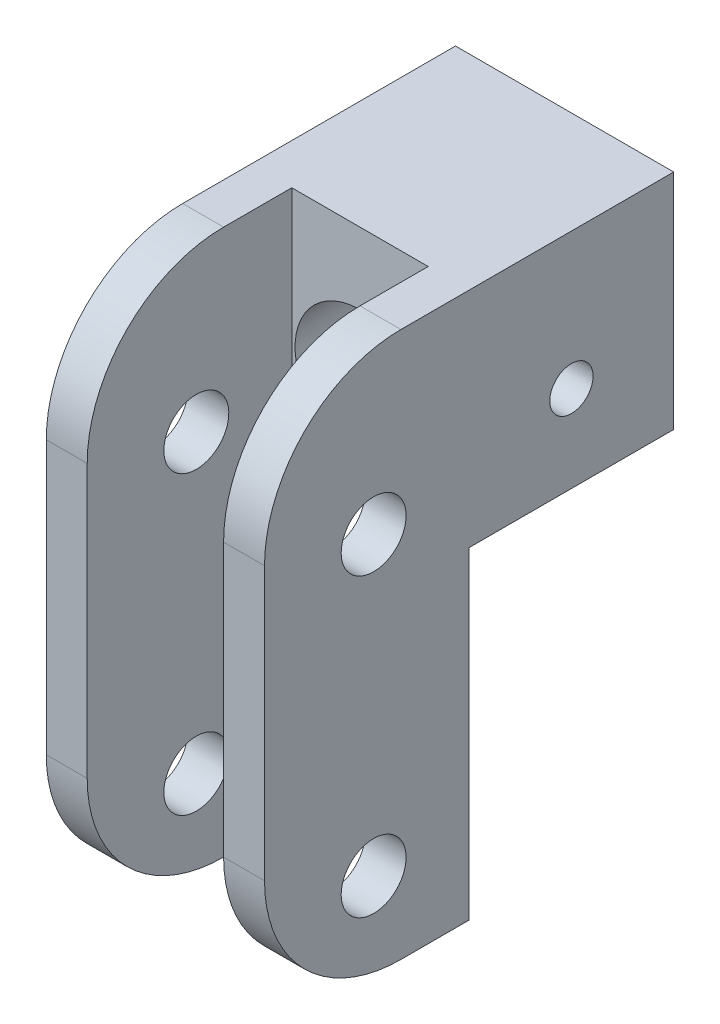
ISO-10303-21;
HEADER;
FILE_DESCRIPTION(('STEP AP214'),'2;1');
FILE_NAME('part.step','',(''),(''),'','','');
FILE_SCHEMA(('AUTOMOTIVE_DESIGN { 1 0 10303 214 1 1 1 1 }'));
ENDSEC;
DATA;
#1=APPLICATION_CONTEXT('core data for automotive mechanical design processes');
#2=APPLICATION_PROTOCOL_DEFINITION('international standard','automotive_design',2000,#1);
#3=PRODUCT_CONTEXT('',#1,'mechanical');
#4=PRODUCT('Part','Part','',(#3));
#5=PRODUCT_RELATED_PRODUCT_CATEGORY('part','',(#4));
#6=PRODUCT_DEFINITION_FORMATION('','',#4);
#7=PRODUCT_DEFINITION_CONTEXT('part definition',#1,'design');
#8=PRODUCT_DEFINITION('design','',#6,#7);
#9=PRODUCT_DEFINITION_SHAPE('','',#8);
#10=(LENGTH_UNIT() NAMED_UNIT(*) SI_UNIT(.MILLI.,.METRE.));
#11=(NAMED_UNIT(*) PLANE_ANGLE_UNIT() SI_UNIT($,.RADIAN.));
#12=(NAMED_UNIT(*) SI_UNIT($,.STERADIAN.) SOLID_ANGLE_UNIT());
#13=UNCERTAINTY_MEASURE_WITH_UNIT(LENGTH_MEASURE(1.E-05),#10,'distance_accuracy_value','');
#14=(GEOMETRIC_REPRESENTATION_CONTEXT(3) GLOBAL_UNCERTAINTY_ASSIGNED_CONTEXT((#13)) GLOBAL_UNIT_ASSIGNED_CONTEXT((#10,
#11,#12)) REPRESENTATION_CONTEXT('',''));
#15=CARTESIAN_POINT('',(0.,0.,0.));
#16=DIRECTION('',(0.,0.,1.));
#17=DIRECTION('',(1.,0.,0.));
#18=AXIS2_PLACEMENT_3D('',#15,#16,#17);
#19=CARTESIAN_POINT('',(-7.99999999999999,-30.,30.));
#20=DIRECTION('',(0.,1.,0.));
#21=DIRECTION('',(-1.,0.,0.));
#22=AXIS2_PLACEMENT_3D('',#19,#20,#21);
#23=PLANE('',#22);
#24=DIRECTION('',(0.,0.,1.));
#25=VECTOR('',#24,1.);
#26=CARTESIAN_POINT('',(-5.,-30.,-41.2310562561766));
#27=LINE('',#26,#25);
#28=CARTESIAN_POINT('',(-5.,-30.,15.));
#29=VERTEX_POINT('',#28);
#30=CARTESIAN_POINT('',(-5.,-30.,20.));
#31=VERTEX_POINT('',#30);
#32=EDGE_CURVE('E218',#29,#31,#27,.T.);
#33=ORIENTED_EDGE('',*,*,#32,.T.);
#34=DIRECTION('',(1.,0.,0.));
#35=VECTOR('',#34,1.);
#36=CARTESIAN_POINT('',(-7.99999999999999,-30.,20.));
#37=LINE('',#36,#35);
#38=CARTESIAN_POINT('',(-7.99999999999999,-30.,20.));
#39=VERTEX_POINT('',#38);
#40=EDGE_CURVE('E150',#31,#39,#37,.F.);
#41=ORIENTED_EDGE('',*,*,#40,.T.);
#42=DIRECTION('',(0.,0.,-1.));
#43=VECTOR('',#42,1.);
#44=CARTESIAN_POINT('',(-7.99999999999999,-30.,30.));
#45=LINE('',#44,#43);
#46=CARTESIAN_POINT('',(-7.99999999999999,-30.,15.));
#47=VERTEX_POINT('',#46);
#48=EDGE_CURVE('E144',#39,#47,#45,.T.);
#49=ORIENTED_EDGE('',*,*,#48,.T.);
#50=DIRECTION('',(-1.,0.,0.));
#51=VECTOR('',#50,1.);
#52=CARTESIAN_POINT('',(8.00000000000002,-30.,15.));
#53=LINE('',#52,#51);
#54=EDGE_CURVE('E147',#29,#47,#53,.T.);
#55=ORIENTED_EDGE('',*,*,#54,.F.);
#56=EDGE_LOOP('',(#33,#41,#49,#55));
#57=FACE_BOUND('',#56,.T.);
#58=ADVANCED_FACE('F35',(#57),#23,.F.);
#59=CARTESIAN_POINT('',(0.,0.,30.));
#60=DIRECTION('',(0.,0.,1.));
#61=DIRECTION('',(1.,0.,0.));
#62=AXIS2_PLACEMENT_3D('',#59,#60,#61);
#63=PLANE('',#62);
#64=DIRECTION('',(0.,1.,0.));
#65=VECTOR('',#64,1.);
#66=CARTESIAN_POINT('',(5.,10.,30.));
#67=LINE('',#66,#65);
#68=CARTESIAN_POINT('',(5.,-20.,30.));
#69=VERTEX_POINT('',#68);
#70=CARTESIAN_POINT('',(5.,0.,30.));
#71=VERTEX_POINT('',#70);
#72=EDGE_CURVE('E204',#69,#71,#67,.T.);
#73=ORIENTED_EDGE('',*,*,#72,.F.);
#74=DIRECTION('',(1.,0.,0.));
#75=VECTOR('',#74,1.);
#76=CARTESIAN_POINT('',(8.00000000000001,-20.,30.));
#77=LINE('',#76,#75);
#78=CARTESIAN_POINT('',(8.00000000000001,-20.,30.));
#79=VERTEX_POINT('',#78);
#80=EDGE_CURVE('E362',#69,#79,#77,.T.);
#81=ORIENTED_EDGE('',*,*,#80,.T.);
#82=DIRECTION('',(0.,1.,0.));
#83=VECTOR('',#82,1.);
#84=CARTESIAN_POINT('',(8.00000000000002,-30.,30.));
#85=LINE('',#84,#83);
#86=CARTESIAN_POINT('',(8.00000000000001,0.,30.));
#87=VERTEX_POINT('',#86);
#88=EDGE_CURVE('E239',#79,#87,#85,.T.);
#89=ORIENTED_EDGE('',*,*,#88,.T.);
#90=DIRECTION('',(-1.,0.,0.));
#91=VECTOR('',#90,1.);
#92=CARTESIAN_POINT('',(5.00000000000001,0.,30.));
#93=LINE('',#92,#91);
#94=EDGE_CURVE('E361',#87,#71,#93,.T.);
#95=ORIENTED_EDGE('',*,*,#94,.T.);
#96=EDGE_LOOP('',(#73,#81,#89,#95));
#97=FACE_BOUND('',#96,.T.);
#98=ADVANCED_FACE('F316',(#97),#63,.T.);
#99=CARTESIAN_POINT('',(0.,0.,30.));
#100=DIRECTION('',(0.,0.,1.));
#101=DIRECTION('',(1.,0.,0.));
#102=AXIS2_PLACEMENT_3D('',#99,#100,#101);
#103=CYLINDRICAL_SURFACE('',#102,4.76249999999999);
#104=CARTESIAN_POINT('',(0.,0.,0.));
#105=DIRECTION('',(0.,0.,1.));
#106=DIRECTION('',(1.,0.,0.));
#107=AXIS2_PLACEMENT_3D('',#104,#105,#106);
#108=CIRCLE('',#107,4.76249999999999);
#109=CARTESIAN_POINT('',(4.76249999999999,0.,0.));
#110=VERTEX_POINT('',#109);
#111=EDGE_CURVE('E234',#110,#110,#108,.T.);
#112=ORIENTED_EDGE('',*,*,#111,.F.);
#113=EDGE_LOOP('',(#112));
#114=FACE_BOUND('',#113,.T.);
#115=CARTESIAN_POINT('',(-4.76249999999999,0.,9.0875));
#116=CARTESIAN_POINT('',(-4.76250024290248,0.0866193385826708,9.08750040279898));
#117=CARTESIAN_POINT('',(-4.76011509093226,0.173236246329945,9.08038757752304));
#118=CARTESIAN_POINT('',(-4.75083521197707,0.343918795385841,9.05221128975266));
#119=CARTESIAN_POINT('',(-4.74394001683416,0.42798417088862,9.03114637898108));
#120=CARTESIAN_POINT('',(-4.72638926301477,0.591078303334067,8.97586820112782));
#121=CARTESIAN_POINT('',(-4.71573999272729,0.670115223594076,8.9416769133459));
#122=CARTESIAN_POINT('',(-4.69176807576279,0.82133271217845,8.86121588811912));
#123=CARTESIAN_POINT('',(-4.67844490185097,0.893511924171942,8.81494376805837));
#124=CARTESIAN_POINT('',(-4.6500112492827,1.03146490909784,8.70995153478673));
#125=CARTESIAN_POINT('',(-4.63485795886257,1.09696837422356,8.65088791561146));
#126=CARTESIAN_POINT('',(-4.60470749718204,1.21734689966455,8.52271964190333));
#127=CARTESIAN_POINT('',(-4.58971036098746,1.27221961946452,8.45361278205099));
#128=CARTESIAN_POINT('',(-4.56109915307671,1.37132209578672,8.30488612962562));
#129=CARTESIAN_POINT('',(-4.54753724850154,1.41520046242588,8.22502118817525));
#130=CARTESIAN_POINT('',(-4.52398297352028,1.48878746228088,8.05852045004706));
#131=CARTESIAN_POINT('',(-4.51398951405183,1.51850041960148,7.97188672900414));
#132=CARTESIAN_POINT('',(-4.49915443940135,1.56189912014579,7.79738126087397));
#133=CARTESIAN_POINT('',(-4.49415052034257,1.57609134913143,7.70964968152361));
#134=CARTESIAN_POINT('',(-4.48938104899342,1.58962903329348,7.53291879027754));
#135=CARTESIAN_POINT('',(-4.48961387798583,1.58897907629748,7.44391987862416));
#136=CARTESIAN_POINT('',(-4.49514936325485,1.57324409712917,7.27150059917012));
#137=CARTESIAN_POINT('',(-4.50021985189708,1.5588200871526,7.18801116036606));
#138=CARTESIAN_POINT('',(-4.51447944137724,1.51702478352344,7.02471294637415));
#139=CARTESIAN_POINT('',(-4.5236690353227,1.48965193971459,6.94490461312183));
#140=CARTESIAN_POINT('',(-4.54529683920856,1.42230325467058,6.78973226002353));
#141=CARTESIAN_POINT('',(-4.55778498196573,1.38213155232277,6.71446050956713));
#142=CARTESIAN_POINT('',(-4.58458186738965,1.29046145625623,6.57151743310594));
#143=CARTESIAN_POINT('',(-4.5988911354236,1.23895979087785,6.50384831099326));
#144=CARTESIAN_POINT('',(-4.62863135053787,1.12291706563305,6.37431708791978));
#145=CARTESIAN_POINT('',(-4.64408185600812,1.05783562574614,6.31294259746686));
#146=CARTESIAN_POINT('',(-4.6737101468942,0.918114067327472,6.20185161417186));
#147=CARTESIAN_POINT('',(-4.68788781016681,0.843473033111539,6.15213623941387));
#148=CARTESIAN_POINT('',(-4.71355908851246,0.685716835710946,6.06538212337683));
#149=CARTESIAN_POINT('',(-4.72502468137761,0.602524951310931,6.02847403249659));
#150=CARTESIAN_POINT('',(-4.74377650341789,0.430639669841153,5.96932746134531));
#151=CARTESIAN_POINT('',(-4.7510641842712,0.341948195570986,5.9470838852653));
#152=CARTESIAN_POINT('',(-4.76039857975911,0.165709329377767,5.91876163018951));
#153=CARTESIAN_POINT('',(-4.76265877911042,0.0782789897854404,5.91202405293826));
#154=CARTESIAN_POINT('',(-4.76232383028037,-0.0964804235618793,5.91302811933757));
#155=CARTESIAN_POINT('',(-4.75972950165737,-0.183809511919947,5.92076731896806));
#156=CARTESIAN_POINT('',(-4.75011789238402,-0.353250287758008,5.94998390353084));
#157=CARTESIAN_POINT('',(-4.74323090454017,-0.435439830850316,5.97105685210358));
#158=CARTESIAN_POINT('',(-4.72585806842735,-0.595083834245074,6.02583709309094));
#159=CARTESIAN_POINT('',(-4.71537176124095,-0.672537689257414,6.05954599665511));
#160=CARTESIAN_POINT('',(-4.69152178418571,-0.822782670524322,6.13962431054725));
#161=CARTESIAN_POINT('',(-4.67808968424809,-0.895397560257221,6.18630341683704));
#162=CARTESIAN_POINT('',(-4.64987090592065,-1.03197791784024,6.29063321314641));
#163=CARTESIAN_POINT('',(-4.635083814552,-1.09594073387548,6.34828725395043));
#164=CARTESIAN_POINT('',(-4.60496996168955,-1.2164258561425,6.47602876722296));
#165=CARTESIAN_POINT('',(-4.58964920726291,-1.27247803867766,6.54656214774639));
#166=CARTESIAN_POINT('',(-4.56088707605349,-1.37200881668867,6.69636236389979));
#167=CARTESIAN_POINT('',(-4.54744571493928,-1.41548730734048,6.7756292723316));
#168=CARTESIAN_POINT('',(-4.5240954696882,-1.48843512703597,6.94068091177271));
#169=CARTESIAN_POINT('',(-4.51417945258853,-1.51793278481197,7.02645205068042));
#170=CARTESIAN_POINT('',(-4.49914696286487,-1.56193278348048,7.20215110694506));
#171=CARTESIAN_POINT('',(-4.49402832815026,-1.57644187973938,7.29207713257941));
#172=CARTESIAN_POINT('',(-4.48941600962755,-1.58952609843278,7.46856288996496));
#173=CARTESIAN_POINT('',(-4.48964685408645,-1.58888153347708,7.55505821520533));
#174=CARTESIAN_POINT('',(-4.49502640845388,-1.5735971408498,7.72663955643877));
#175=CARTESIAN_POINT('',(-4.5001748256636,-1.5589581461405,7.8117256560037));
#176=CARTESIAN_POINT('',(-4.51460432334014,-1.51665275334283,7.97646536501643));
#177=CARTESIAN_POINT('',(-4.52380505610682,-1.48923906179963,8.05619145969464));
#178=CARTESIAN_POINT('',(-4.54527283124318,-1.4223672431436,8.2099735085145));
#179=CARTESIAN_POINT('',(-4.55754055411885,-1.38290644257917,8.28402819951096));
#180=CARTESIAN_POINT('',(-4.58442741396347,-1.29105134947619,8.42786782600262));
#181=CARTESIAN_POINT('',(-4.59912579731891,-1.23816783538877,8.49732544676369));
#182=CARTESIAN_POINT('',(-4.62888578099663,-1.12179557697784,8.62663257874742));
#183=CARTESIAN_POINT('',(-4.6439474829839,-1.05830383406673,8.68647936390482));
#184=CARTESIAN_POINT('',(-4.673441734593,-0.919545971611592,8.79721675450907));
#185=CARTESIAN_POINT('',(-4.68782688609494,-0.843917402680819,8.84766740205471));
#186=CARTESIAN_POINT('',(-4.71370010986521,-0.684779804883016,8.9350848058004));
#187=CARTESIAN_POINT('',(-4.72518892253837,-0.601272797535103,8.97205500915124));
#188=CARTESIAN_POINT('',(-4.74353755171309,-0.43258366493155,9.02990809157576));
#189=CARTESIAN_POINT('',(-4.75058124720754,-0.3476430653113,9.05143591519311));
#190=CARTESIAN_POINT('',(-4.76006171214451,-0.175133660416269,9.08022969557494));
#191=CARTESIAN_POINT('',(-4.76249975444398,-0.087565588090387,9.08749959280075));
#192=CARTESIAN_POINT('',(-4.76249999999999,0.,9.0875));
#193=B_SPLINE_CURVE_WITH_KNOTS('',3,(#115,#116,#117,#118,#119,#120,#121,#122,#123,#124,#125,
#126,#127,#128,#129,#130,#131,#132,#133,#134,#135,#136,#137,#138,#139,#140,#141,#142,#143,#144,
#145,#146,#147,#148,#149,#150,#151,#152,#153,#154,#155,#156,#157,#158,#159,#160,#161,#162,#163,
#164,#165,#166,#167,#168,#169,#170,#171,#172,#173,#174,#175,#176,#177,#178,#179,#180,#181,#182,
#183,#184,#185,#186,#187,#188,#189,#190,#191,#192),.UNSPECIFIED.,.T.,.F.,(4,2,2,2,2,2,2,2,2,2,2,
2,2,2,2,2,2,2,2,2,2,2,2,2,2,2,2,2,2,2,2,2,2,2,2,2,2,2,4),(0.,0.259535780816292,
0.519098506612188,0.778228493181558,1.03740962475607,1.30468186298875,1.57201287843954,
1.84703060907259,2.12196433449873,2.38763057115171,2.65321468955133,2.90666212150157,
3.16013990233077,3.41769971708769,3.67533400311153,3.94641872975544,4.21752944222006,
4.49132968969942,4.76503474342567,5.02687563290581,5.28867232148129,5.54288575790413,
5.79713161888514,6.0580650975193,6.31907837054751,6.59195123823192,6.86482638073056,
7.13714621949997,7.4093432697052,7.66755619877009,7.92575375970307,8.17904744490161,
8.43239738104363,8.69680230873239,8.96128210158997,9.2360696157572,9.51078681329523,
9.77323036418427,10.0356013733555),.UNSPECIFIED.);
#194=CARTESIAN_POINT('',(-4.76249999999999,0.,9.0875));
#195=VERTEX_POINT('',#194);
#196=EDGE_CURVE('E233',#195,#195,#193,.T.);
#197=ORIENTED_EDGE('',*,*,#196,.T.);
#198=EDGE_LOOP('',(#197));
#199=FACE_BOUND('',#198,.T.);
#200=CARTESIAN_POINT('',(4.76249999999999,0.,5.9125));
#201=CARTESIAN_POINT('',(4.76250024290248,0.0866193385826729,5.91249959720102));
#202=CARTESIAN_POINT('',(4.76011509093226,0.173236246329947,5.91961242247696));
#203=CARTESIAN_POINT('',(4.75083521197707,0.343918795385843,5.94778871024734));
#204=CARTESIAN_POINT('',(4.74394001683416,0.427984170888622,5.96885362101892));
#205=CARTESIAN_POINT('',(4.72638926301477,0.591078303334068,6.02413179887218));
#206=CARTESIAN_POINT('',(4.71573999272729,0.670115223594078,6.0583230866541));
#207=CARTESIAN_POINT('',(4.69176807576279,0.821332712178451,6.13878411188088));
#208=CARTESIAN_POINT('',(4.67844490185096,0.893511924171943,6.18505623194163));
#209=CARTESIAN_POINT('',(4.65001124928269,1.03146490909785,6.29004846521327));
#210=CARTESIAN_POINT('',(4.63485795886257,1.09696837422356,6.34911208438854));
#211=CARTESIAN_POINT('',(4.60470749718204,1.21734689966456,6.47728035809668));
#212=CARTESIAN_POINT('',(4.58971036098746,1.27221961946452,6.54638721794902));
#213=CARTESIAN_POINT('',(4.56109915307671,1.37132209578672,6.69511387037438));
#214=CARTESIAN_POINT('',(4.54753724850154,1.41520046242588,6.77497881182475));
#215=CARTESIAN_POINT('',(4.52398297352028,1.48878746228088,6.94147954995295));
#216=CARTESIAN_POINT('',(4.51398951405183,1.51850041960148,7.02811327099586));
#217=CARTESIAN_POINT('',(4.49915443940135,1.56189912014579,7.20261873912603));
#218=CARTESIAN_POINT('',(4.49415052034257,1.57609134913143,7.29035031847639));
#219=CARTESIAN_POINT('',(4.48938104899342,1.58962903329348,7.46708120972246));
#220=CARTESIAN_POINT('',(4.48961387798583,1.58897907629748,7.55608012137584));
#221=CARTESIAN_POINT('',(4.49514936325485,1.57324409712917,7.72849940082989));
#222=CARTESIAN_POINT('',(4.50021985189708,1.5588200871526,7.81198883963394));
#223=CARTESIAN_POINT('',(4.51447944137724,1.51702478352344,7.97528705362585));
#224=CARTESIAN_POINT('',(4.5236690353227,1.48965193971459,8.05509538687817));
#225=CARTESIAN_POINT('',(4.54529683920856,1.42230325467058,8.21026773997647));
#226=CARTESIAN_POINT('',(4.55778498196573,1.38213155232277,8.28553949043287));
#227=CARTESIAN_POINT('',(4.58458186738965,1.29046145625623,8.42848256689406));
#228=CARTESIAN_POINT('',(4.5988911354236,1.23895979087785,8.49615168900674));
#229=CARTESIAN_POINT('',(4.62863135053787,1.12291706563305,8.62568291208023));
#230=CARTESIAN_POINT('',(4.64408185600812,1.05783562574614,8.68705740253315));
#231=CARTESIAN_POINT('',(4.6737101468942,0.918114067327471,8.79814838582814));
#232=CARTESIAN_POINT('',(4.68788781016681,0.843473033111538,8.84786376058613));
#233=CARTESIAN_POINT('',(4.71355908851246,0.685716835710945,8.93461787662317));
#234=CARTESIAN_POINT('',(4.72502468137761,0.60252495131093,8.97152596750341));
#235=CARTESIAN_POINT('',(4.74377650341789,0.430639669841151,9.03067253865469));
#236=CARTESIAN_POINT('',(4.7510641842712,0.341948195570984,9.0529161147347));
#237=CARTESIAN_POINT('',(4.76039857975911,0.165709329377765,9.08123836981049));
#238=CARTESIAN_POINT('',(4.76265877911042,0.0782789897854381,9.08797594706174));
#239=CARTESIAN_POINT('',(4.76232383028037,-0.0964804235618813,9.08697188066243));
#240=CARTESIAN_POINT('',(4.75972950165736,-0.183809511919949,9.07923268103194));
#241=CARTESIAN_POINT('',(4.75011789238402,-0.353250287758009,9.05001609646916));
#242=CARTESIAN_POINT('',(4.74323090454017,-0.435439830850318,9.02894314789643));
#243=CARTESIAN_POINT('',(4.72585806842735,-0.595083834245076,8.97416290690907));
#244=CARTESIAN_POINT('',(4.71537176124095,-0.672537689257415,8.94045400334489));
#245=CARTESIAN_POINT('',(4.69152178418571,-0.822782670524323,8.86037568945275));
#246=CARTESIAN_POINT('',(4.67808968424809,-0.895397560257222,8.81369658316296));
#247=CARTESIAN_POINT('',(4.64987090592065,-1.03197791784025,8.70936678685359));
#248=CARTESIAN_POINT('',(4.635083814552,-1.09594073387548,8.65171274604957));
#249=CARTESIAN_POINT('',(4.60496996168955,-1.2164258561425,8.52397123277704));
#250=CARTESIAN_POINT('',(4.58964920726291,-1.27247803867766,8.4534378522536));
#251=CARTESIAN_POINT('',(4.56088707605349,-1.37200881668868,8.30363763610021));
#252=CARTESIAN_POINT('',(4.54744571493927,-1.41548730734048,8.2243707276684));
#253=CARTESIAN_POINT('',(4.5240954696882,-1.48843512703597,8.05931908822729));
#254=CARTESIAN_POINT('',(4.51417945258853,-1.51793278481197,7.97354794931958));
#255=CARTESIAN_POINT('',(4.49914696286487,-1.56193278348048,7.79784889305494));
#256=CARTESIAN_POINT('',(4.49402832815026,-1.57644187973938,7.70792286742059));
#257=CARTESIAN_POINT('',(4.48941600962755,-1.58952609843278,7.53143711003504));
#258=CARTESIAN_POINT('',(4.48964685408645,-1.58888153347708,7.44494178479467));
#259=CARTESIAN_POINT('',(4.49502640845388,-1.5735971408498,7.27336044356123));
#260=CARTESIAN_POINT('',(4.5001748256636,-1.5589581461405,7.1882743439963));
#261=CARTESIAN_POINT('',(4.51460432334014,-1.51665275334283,7.02353463498357));
#262=CARTESIAN_POINT('',(4.52380505610682,-1.48923906179963,6.94380854030536));
#263=CARTESIAN_POINT('',(4.54527283124318,-1.4223672431436,6.7900264914855));
#264=CARTESIAN_POINT('',(4.55754055411886,-1.38290644257916,6.71597180048904));
#265=CARTESIAN_POINT('',(4.58442741396347,-1.29105134947619,6.57213217399738));
#266=CARTESIAN_POINT('',(4.59912579731891,-1.23816783538877,6.50267455323631));
#267=CARTESIAN_POINT('',(4.62888578099663,-1.12179557697784,6.37336742125258));
#268=CARTESIAN_POINT('',(4.6439474829839,-1.05830383406673,6.31352063609518));
#269=CARTESIAN_POINT('',(4.673441734593,-0.919545971611591,6.20278324549093));
#270=CARTESIAN_POINT('',(4.68782688609494,-0.843917402680818,6.15233259794529));
#271=CARTESIAN_POINT('',(4.71370010986521,-0.684779804883016,6.0649151941996));
#272=CARTESIAN_POINT('',(4.72518892253837,-0.601272797535102,6.02794499084876));
#273=CARTESIAN_POINT('',(4.74353755171309,-0.432583664931548,5.97009190842424));
#274=CARTESIAN_POINT('',(4.75058124720754,-0.347643065311298,5.94856408480689));
#275=CARTESIAN_POINT('',(4.76006171214451,-0.175133660416267,5.91977030442507));
#276=CARTESIAN_POINT('',(4.76249975444398,-0.0875655880903847,5.91250040719925));
#277=CARTESIAN_POINT('',(4.76249999999999,0.,5.9125));
#278=B_SPLINE_CURVE_WITH_KNOTS('',3,(#200,#201,#202,#203,#204,#205,#206,#207,#208,#209,#210,
#211,#212,#213,#214,#215,#216,#217,#218,#219,#220,#221,#222,#223,#224,#225,#226,#227,#228,#229,
#230,#231,#232,#233,#234,#235,#236,#237,#238,#239,#240,#241,#242,#243,#244,#245,#246,#247,#248,
#249,#250,#251,#252,#253,#254,#255,#256,#257,#258,#259,#260,#261,#262,#263,#264,#265,#266,#267,
#268,#269,#270,#271,#272,#273,#274,#275,#276,#277),.UNSPECIFIED.,.T.,.F.,(4,2,2,2,2,2,2,2,2,2,2,
2,2,2,2,2,2,2,2,2,2,2,2,2,2,2,2,2,2,2,2,2,2,2,2,2,2,2,4),(0.,0.259535780816292,
0.519098506612188,0.778228493181558,1.03740962475607,1.30468186298875,1.57201287843954,
1.84703060907259,2.12196433449873,2.38763057115171,2.65321468955133,2.90666212150157,
3.16013990233077,3.41769971708769,3.67533400311153,3.94641872975544,4.21752944222006,
4.49132968969942,4.76503474342567,5.02687563290581,5.28867232148129,5.54288575790413,
5.79713161888514,6.05806509751931,6.31907837054751,6.59195123823192,6.86482638073056,
7.13714621949997,7.4093432697052,7.66755619877008,7.92575375970307,8.17904744490161,
8.43239738104363,8.69680230873238,8.96128210158997,9.2360696157572,9.51078681329523,
9.77323036418427,10.0356013733554),.UNSPECIFIED.);
#279=CARTESIAN_POINT('',(4.76249999999999,0.,5.9125));
#280=VERTEX_POINT('',#279);
#281=EDGE_CURVE('E238',#280,#280,#278,.T.);
#282=ORIENTED_EDGE('',*,*,#281,.T.);
#283=EDGE_LOOP('',(#282));
#284=FACE_BOUND('',#283,.T.);
#285=CARTESIAN_POINT('',(0.,0.,15.));
#286=DIRECTION('',(0.,0.,1.));
#287=DIRECTION('',(1.,0.,0.));
#288=AXIS2_PLACEMENT_3D('',#285,#286,#287);
#289=CIRCLE('',#288,4.76249999999999);
#290=CARTESIAN_POINT('',(4.76249999999999,0.,15.));
#291=VERTEX_POINT('',#290);
#292=EDGE_CURVE('E226',#291,#291,#289,.F.);
#293=ORIENTED_EDGE('',*,*,#292,.F.);
#294=EDGE_LOOP('',(#293));
#295=FACE_BOUND('',#294,.T.);
#296=ADVANCED_FACE('F268',(#114,#199,#284,#295),#103,.F.);
#297=DIRECTION('',(0.,0.,-1.));
#298=VECTOR('',#297,1.);
#299=CARTESIAN_POINT('',(8.00000000000002,-30.,30.));
#300=LINE('',#299,#298);
#301=CARTESIAN_POINT('',(8.00000000000002,-30.,20.));
#302=VERTEX_POINT('',#301);
#303=CARTESIAN_POINT('',(8.00000000000002,-30.,15.));
#304=VERTEX_POINT('',#303);
#305=EDGE_CURVE('E254',#302,#304,#300,.T.);
#306=ORIENTED_EDGE('',*,*,#305,.F.);
#307=DIRECTION('',(1.,0.,0.));
#308=VECTOR('',#307,1.);
#309=CARTESIAN_POINT('',(5.,-30.,20.));
#310=LINE('',#309,#308);
#311=CARTESIAN_POINT('',(5.,-30.,20.));
#312=VERTEX_POINT('',#311);
#313=EDGE_CURVE('E58',#302,#312,#310,.F.);
#314=ORIENTED_EDGE('',*,*,#313,.T.);
#315=DIRECTION('',(0.,0.,1.));
#316=VECTOR('',#315,1.);
#317=CARTESIAN_POINT('',(5.,-30.,-41.2310562561766));
#318=LINE('',#317,#316);
#319=CARTESIAN_POINT('',(5.,-30.,15.));
#320=VERTEX_POINT('',#319);
#321=EDGE_CURVE('E216',#320,#312,#318,.T.);
#322=ORIENTED_EDGE('',*,*,#321,.F.);
#323=EDGE_CURVE('E164',#304,#320,#53,.T.);
#324=ORIENTED_EDGE('',*,*,#323,.F.);
#325=EDGE_LOOP('',(#306,#314,#322,#324));
#326=FACE_BOUND('',#325,.T.);
#327=ADVANCED_FACE('F318',(#326),#23,.F.);
#328=CARTESIAN_POINT('',(8.00000000000002,-30.,30.));
#329=DIRECTION('',(-1.,0.,0.));
#330=DIRECTION('',(0.,-1.,0.));
#331=AXIS2_PLACEMENT_3D('',#328,#329,#330);
#332=PLANE('',#331);
#333=CARTESIAN_POINT('',(8.00000000000002,-2.,22.));
#334=DIRECTION('',(-1.,0.,0.));
#335=DIRECTION('',(0.,0.,1.));
#336=AXIS2_PLACEMENT_3D('',#333,#334,#335);
#337=CIRCLE('',#336,2.38125);
#338=CARTESIAN_POINT('',(8.00000000000002,-2.,24.38125));
#339=VERTEX_POINT('',#338);
#340=EDGE_CURVE('E187',#339,#339,#337,.T.);
#341=ORIENTED_EDGE('',*,*,#340,.T.);
#342=EDGE_LOOP('',(#341));
#343=FACE_BOUND('',#342,.T.);
#344=CARTESIAN_POINT('',(8.00000000000003,-23.7,22.));
#345=DIRECTION('',(-1.,0.,0.));
#346=DIRECTION('',(0.,0.,1.));
#347=AXIS2_PLACEMENT_3D('',#344,#345,#346);
#348=CIRCLE('',#347,2.38124999999999);
#349=CARTESIAN_POINT('',(8.00000000000003,-23.7,24.38125));
#350=VERTEX_POINT('',#349);
#351=EDGE_CURVE('E197',#350,#350,#348,.T.);
#352=ORIENTED_EDGE('',*,*,#351,.T.);
#353=EDGE_LOOP('',(#352));
#354=FACE_BOUND('',#353,.T.);
#355=CARTESIAN_POINT('',(8.00000000000001,0.,7.5));
#356=DIRECTION('',(-1.,0.,0.));
#357=DIRECTION('',(0.,0.,1.));
#358=AXIS2_PLACEMENT_3D('',#355,#356,#357);
#359=CIRCLE('',#358,1.5875);
#360=CARTESIAN_POINT('',(8.00000000000001,0.,9.0875));
#361=VERTEX_POINT('',#360);
#362=EDGE_CURVE('E230',#361,#361,#359,.T.);
#363=ORIENTED_EDGE('',*,*,#362,.T.);
#364=EDGE_LOOP('',(#363));
#365=FACE_BOUND('',#364,.T.);
#366=ORIENTED_EDGE('',*,*,#88,.F.);
#367=CARTESIAN_POINT('',(8.00000000000001,-20.,20.));
#368=DIRECTION('',(-1.,0.,0.));
#369=DIRECTION('',(0.,-1.,0.));
#370=AXIS2_PLACEMENT_3D('',#367,#368,#369);
#371=CIRCLE('',#370,10.);
#372=EDGE_CURVE('E341',#79,#302,#371,.F.);
#373=ORIENTED_EDGE('',*,*,#372,.T.);
#374=ORIENTED_EDGE('',*,*,#305,.T.);
#375=DIRECTION('',(0.,-1.,0.));
#376=VECTOR('',#375,1.);
#377=CARTESIAN_POINT('',(8.00000000000002,-30.,15.));
#378=LINE('',#377,#376);
#379=CARTESIAN_POINT('',(8.00000000000002,-6.35,15.));
#380=VERTEX_POINT('',#379);
#381=EDGE_CURVE('E179',#380,#304,#378,.T.);
#382=ORIENTED_EDGE('',*,*,#381,.F.);
#383=DIRECTION('',(0.,0.,-1.));
#384=VECTOR('',#383,1.);
#385=CARTESIAN_POINT('',(8.00000000000002,-6.35,43.5538526297241));
#386=LINE('',#385,#384);
#387=CARTESIAN_POINT('',(8.00000000000002,-6.35,0.));
#388=VERTEX_POINT('',#387);
#389=EDGE_CURVE('E177',#380,#388,#386,.T.);
#390=ORIENTED_EDGE('',*,*,#389,.T.);
#391=DIRECTION('',(0.,1.,0.));
#392=VECTOR('',#391,1.);
#393=CARTESIAN_POINT('',(8.00000000000002,-30.,0.));
#394=LINE('',#393,#392);
#395=CARTESIAN_POINT('',(8.,10.,0.));
#396=VERTEX_POINT('',#395);
#397=EDGE_CURVE('E237',#388,#396,#394,.T.);
#398=ORIENTED_EDGE('',*,*,#397,.T.);
#399=DIRECTION('',(0.,0.,-1.));
#400=VECTOR('',#399,1.);
#401=CARTESIAN_POINT('',(8.,10.,30.));
#402=LINE('',#401,#400);
#403=CARTESIAN_POINT('',(8.,10.,20.));
#404=VERTEX_POINT('',#403);
#405=EDGE_CURVE('E252',#404,#396,#402,.T.);
#406=ORIENTED_EDGE('',*,*,#405,.F.);
#407=CARTESIAN_POINT('',(8.00000000000001,0.,20.));
#408=DIRECTION('',(-1.,0.,0.));
#409=DIRECTION('',(0.,-1.,0.));
#410=AXIS2_PLACEMENT_3D('',#407,#408,#409);
#411=CIRCLE('',#410,10.);
#412=EDGE_CURVE('E346',#404,#87,#411,.F.);
#413=ORIENTED_EDGE('',*,*,#412,.T.);
#414=EDGE_LOOP('',(#366,#373,#374,#382,#390,#398,#406,#413));
#415=FACE_BOUND('',#414,.T.);
#416=ADVANCED_FACE('F326',(#343,#354,#365,#415),#332,.F.);
#417=CARTESIAN_POINT('',(8.,10.,30.));
#418=DIRECTION('',(0.,-1.,0.));
#419=DIRECTION('',(1.,0.,0.));
#420=AXIS2_PLACEMENT_3D('',#417,#418,#419);
#421=PLANE('',#420);
#422=DIRECTION('',(0.,0.,-1.));
#423=VECTOR('',#422,1.);
#424=CARTESIAN_POINT('',(-8.,10.,30.));
#425=LINE('',#424,#423);
#426=CARTESIAN_POINT('',(-8.,10.,20.));
#427=VERTEX_POINT('',#426);
#428=CARTESIAN_POINT('',(-8.,10.,0.));
#429=VERTEX_POINT('',#428);
#430=EDGE_CURVE('E154',#427,#429,#425,.T.);
#431=ORIENTED_EDGE('',*,*,#430,.F.);
#432=DIRECTION('',(-1.,0.,0.));
#433=VECTOR('',#432,1.);
#434=CARTESIAN_POINT('',(-5.,10.,20.));
#435=LINE('',#434,#433);
#436=CARTESIAN_POINT('',(-5.,10.,20.));
#437=VERTEX_POINT('',#436);
#438=EDGE_CURVE('E12',#427,#437,#435,.F.);
#439=ORIENTED_EDGE('',*,*,#438,.T.);
#440=DIRECTION('',(0.,0.,1.));
#441=VECTOR('',#440,1.);
#442=CARTESIAN_POINT('',(-5.,10.,-41.2310562561766));
#443=LINE('',#442,#441);
#444=CARTESIAN_POINT('',(-5.,10.,15.));
#445=VERTEX_POINT('',#444);
#446=EDGE_CURVE('E220',#445,#437,#443,.T.);
#447=ORIENTED_EDGE('',*,*,#446,.F.);
#448=DIRECTION('',(1.,0.,0.));
#449=VECTOR('',#448,1.);
#450=CARTESIAN_POINT('',(5.,10.,15.));
#451=LINE('',#450,#449);
#452=CARTESIAN_POINT('',(5.,10.,15.));
#453=VERTEX_POINT('',#452);
#454=EDGE_CURVE('E210',#445,#453,#451,.T.);
#455=ORIENTED_EDGE('',*,*,#454,.T.);
#456=DIRECTION('',(0.,0.,1.));
#457=VECTOR('',#456,1.);
#458=CARTESIAN_POINT('',(5.,10.,-41.2310562561766));
#459=LINE('',#458,#457);
#460=CARTESIAN_POINT('',(5.,10.,20.));
#461=VERTEX_POINT('',#460);
#462=EDGE_CURVE('E215',#453,#461,#459,.T.);
#463=ORIENTED_EDGE('',*,*,#462,.T.);
#464=DIRECTION('',(-1.,0.,0.));
#465=VECTOR('',#464,1.);
#466=CARTESIAN_POINT('',(8.,10.,20.));
#467=LINE('',#466,#465);
#468=EDGE_CURVE('E43',#461,#404,#467,.F.);
#469=ORIENTED_EDGE('',*,*,#468,.T.);
#470=ORIENTED_EDGE('',*,*,#405,.T.);
#471=DIRECTION('',(-1.,0.,0.));
#472=VECTOR('',#471,1.);
#473=CARTESIAN_POINT('',(8.,10.,0.));
#474=LINE('',#473,#472);
#475=EDGE_CURVE('E247',#396,#429,#474,.T.);
#476=ORIENTED_EDGE('',*,*,#475,.T.);
#477=EDGE_LOOP('',(#431,#439,#447,#455,#463,#469,#470,#476));
#478=FACE_BOUND('',#477,.T.);
#479=ADVANCED_FACE('F331',(#478),#421,.F.);
#480=CARTESIAN_POINT('',(-8.,10.,30.));
#481=DIRECTION('',(1.,0.,0.));
#482=DIRECTION('',(0.,1.,0.));
#483=AXIS2_PLACEMENT_3D('',#480,#481,#482);
#484=PLANE('',#483);
#485=CARTESIAN_POINT('',(-7.99999999999999,-2.,22.));
#486=DIRECTION('',(-1.,0.,0.));
#487=DIRECTION('',(0.,0.,1.));
#488=AXIS2_PLACEMENT_3D('',#485,#486,#487);
#489=CIRCLE('',#488,2.38125);
#490=CARTESIAN_POINT('',(-7.99999999999999,-2.,24.38125));
#491=VERTEX_POINT('',#490);
#492=EDGE_CURVE('E184',#491,#491,#489,.T.);
#493=ORIENTED_EDGE('',*,*,#492,.F.);
#494=EDGE_LOOP('',(#493));
#495=FACE_BOUND('',#494,.T.);
#496=CARTESIAN_POINT('',(-7.99999999999999,-23.7,22.));
#497=DIRECTION('',(-1.,0.,0.));
#498=DIRECTION('',(0.,0.,1.));
#499=AXIS2_PLACEMENT_3D('',#496,#497,#498);
#500=CIRCLE('',#499,2.38125);
#501=CARTESIAN_POINT('',(-7.99999999999999,-23.7,24.38125));
#502=VERTEX_POINT('',#501);
#503=EDGE_CURVE('E194',#502,#502,#500,.T.);
#504=ORIENTED_EDGE('',*,*,#503,.F.);
#505=EDGE_LOOP('',(#504));
#506=FACE_BOUND('',#505,.T.);
#507=CARTESIAN_POINT('',(-7.99999999999999,0.,7.5));
#508=DIRECTION('',(-1.,0.,0.));
#509=DIRECTION('',(0.,0.,1.));
#510=AXIS2_PLACEMENT_3D('',#507,#508,#509);
#511=CIRCLE('',#510,1.5875);
#512=CARTESIAN_POINT('',(-7.99999999999999,0.,9.0875));
#513=VERTEX_POINT('',#512);
#514=EDGE_CURVE('E227',#513,#513,#511,.T.);
#515=ORIENTED_EDGE('',*,*,#514,.F.);
#516=EDGE_LOOP('',(#515));
#517=FACE_BOUND('',#516,.T.);
#518=ORIENTED_EDGE('',*,*,#48,.F.);
#519=CARTESIAN_POINT('',(-7.99999999999999,-20.,20.));
#520=DIRECTION('',(1.,0.,0.));
#521=DIRECTION('',(0.,1.,0.));
#522=AXIS2_PLACEMENT_3D('',#519,#520,#521);
#523=CIRCLE('',#522,10.);
#524=CARTESIAN_POINT('',(-7.99999999999999,-20.,30.));
#525=VERTEX_POINT('',#524);
#526=EDGE_CURVE('E366',#39,#525,#523,.F.);
#527=ORIENTED_EDGE('',*,*,#526,.T.);
#528=DIRECTION('',(0.,-1.,0.));
#529=VECTOR('',#528,1.);
#530=CARTESIAN_POINT('',(-8.,10.,30.));
#531=LINE('',#530,#529);
#532=CARTESIAN_POINT('',(-7.99999999999999,0.,30.));
#533=VERTEX_POINT('',#532);
#534=EDGE_CURVE('E155',#533,#525,#531,.T.);
#535=ORIENTED_EDGE('',*,*,#534,.F.);
#536=CARTESIAN_POINT('',(-7.99999999999999,0.,20.));
#537=DIRECTION('',(1.,0.,0.));
#538=DIRECTION('',(0.,1.,0.));
#539=AXIS2_PLACEMENT_3D('',#536,#537,#538);
#540=CIRCLE('',#539,10.);
#541=EDGE_CURVE('E368',#533,#427,#540,.F.);
#542=ORIENTED_EDGE('',*,*,#541,.T.);
#543=ORIENTED_EDGE('',*,*,#430,.T.);
#544=DIRECTION('',(0.,-1.,0.));
#545=VECTOR('',#544,1.);
#546=CARTESIAN_POINT('',(-8.,10.,0.));
#547=LINE('',#546,#545);
#548=CARTESIAN_POINT('',(-8.,-6.35,0.));
#549=VERTEX_POINT('',#548);
#550=EDGE_CURVE('E242',#429,#549,#547,.T.);
#551=ORIENTED_EDGE('',*,*,#550,.T.);
#552=DIRECTION('',(0.,0.,-1.));
#553=VECTOR('',#552,1.);
#554=CARTESIAN_POINT('',(-8.,-6.35,43.5538526297241));
#555=LINE('',#554,#553);
#556=CARTESIAN_POINT('',(-8.,-6.35,15.));
#557=VERTEX_POINT('',#556);
#558=EDGE_CURVE('E169',#557,#549,#555,.T.);
#559=ORIENTED_EDGE('',*,*,#558,.F.);
#560=DIRECTION('',(0.,1.,0.));
#561=VECTOR('',#560,1.);
#562=CARTESIAN_POINT('',(-7.99999999999999,-30.,15.));
#563=LINE('',#562,#561);
#564=EDGE_CURVE('E160',#47,#557,#563,.T.);
#565=ORIENTED_EDGE('',*,*,#564,.F.);
#566=EDGE_LOOP('',(#518,#527,#535,#542,#543,#551,#559,#565));
#567=FACE_BOUND('',#566,.T.);
#568=ADVANCED_FACE('F167',(#495,#506,#517,#567),#484,.F.);
#569=ORIENTED_EDGE('',*,*,#534,.T.);
#570=DIRECTION('',(1.,0.,0.));
#571=VECTOR('',#570,1.);
#572=CARTESIAN_POINT('',(-5.,-20.,30.));
#573=LINE('',#572,#571);
#574=CARTESIAN_POINT('',(-5.,-20.,30.));
#575=VERTEX_POINT('',#574);
#576=EDGE_CURVE('E375',#525,#575,#573,.T.);
#577=ORIENTED_EDGE('',*,*,#576,.T.);
#578=DIRECTION('',(0.,-1.,0.));
#579=VECTOR('',#578,1.);
#580=CARTESIAN_POINT('',(-5.,10.,30.));
#581=LINE('',#580,#579);
#582=CARTESIAN_POINT('',(-5.,0.,30.));
#583=VERTEX_POINT('',#582);
#584=EDGE_CURVE('E212',#583,#575,#581,.T.);
#585=ORIENTED_EDGE('',*,*,#584,.F.);
#586=DIRECTION('',(-1.,0.,0.));
#587=VECTOR('',#586,1.);
#588=CARTESIAN_POINT('',(-7.99999999999999,0.,30.));
#589=LINE('',#588,#587);
#590=EDGE_CURVE('E256',#583,#533,#589,.T.);
#591=ORIENTED_EDGE('',*,*,#590,.T.);
#592=EDGE_LOOP('',(#569,#577,#585,#591));
#593=FACE_BOUND('',#592,.T.);
#594=ADVANCED_FACE('F323',(#593),#63,.T.);
#595=CARTESIAN_POINT('',(0.,0.,0.));
#596=DIRECTION('',(0.,0.,1.));
#597=DIRECTION('',(1.,0.,0.));
#598=AXIS2_PLACEMENT_3D('',#595,#596,#597);
#599=PLANE('',#598);
#600=ORIENTED_EDGE('',*,*,#111,.T.);
#601=EDGE_LOOP('',(#600));
#602=FACE_BOUND('',#601,.T.);
#603=ORIENTED_EDGE('',*,*,#397,.F.);
#604=DIRECTION('',(1.,0.,0.));
#605=VECTOR('',#604,1.);
#606=CARTESIAN_POINT('',(8.00000000000002,-6.35,0.));
#607=LINE('',#606,#605);
#608=EDGE_CURVE('E165',#549,#388,#607,.T.);
#609=ORIENTED_EDGE('',*,*,#608,.F.);
#610=ORIENTED_EDGE('',*,*,#550,.F.);
#611=ORIENTED_EDGE('',*,*,#475,.F.);
#612=EDGE_LOOP('',(#603,#609,#610,#611));
#613=FACE_BOUND('',#612,.T.);
#614=ADVANCED_FACE('F405',(#602,#613),#599,.F.);
#615=CARTESIAN_POINT('',(-7.99999999999999,0.,7.5));
#616=DIRECTION('',(-1.,0.,0.));
#617=DIRECTION('',(0.,0.,1.));
#618=AXIS2_PLACEMENT_3D('',#615,#616,#617);
#619=CYLINDRICAL_SURFACE('',#618,1.5875);
#620=ORIENTED_EDGE('',*,*,#514,.T.);
#621=EDGE_LOOP('',(#620));
#622=FACE_BOUND('',#621,.T.);
#623=ORIENTED_EDGE('',*,*,#196,.F.);
#624=EDGE_LOOP('',(#623));
#625=FACE_BOUND('',#624,.T.);
#626=ADVANCED_FACE('F276',(#622,#625),#619,.F.);
#627=ORIENTED_EDGE('',*,*,#362,.F.);
#628=EDGE_LOOP('',(#627));
#629=FACE_BOUND('',#628,.T.);
#630=ORIENTED_EDGE('',*,*,#281,.F.);
#631=EDGE_LOOP('',(#630));
#632=FACE_BOUND('',#631,.T.);
#633=ADVANCED_FACE('F271',(#629,#632),#619,.F.);
#634=CARTESIAN_POINT('',(0.,0.,15.));
#635=DIRECTION('',(0.,0.,1.));
#636=DIRECTION('',(1.,0.,0.));
#637=AXIS2_PLACEMENT_3D('',#634,#635,#636);
#638=PLANE('',#637);
#639=DIRECTION('',(1.,0.,0.));
#640=VECTOR('',#639,1.);
#641=CARTESIAN_POINT('',(8.00000000000002,-6.35,15.));
#642=LINE('',#641,#640);
#643=CARTESIAN_POINT('',(-5.,-6.35,15.));
#644=VERTEX_POINT('',#643);
#645=CARTESIAN_POINT('',(5.,-6.35,15.));
#646=VERTEX_POINT('',#645);
#647=EDGE_CURVE('E502',#644,#646,#642,.T.);
#648=ORIENTED_EDGE('',*,*,#647,.T.);
#649=DIRECTION('',(0.,-1.,0.));
#650=VECTOR('',#649,1.);
#651=CARTESIAN_POINT('',(5.,10.,15.));
#652=LINE('',#651,#650);
#653=EDGE_CURVE('E206',#453,#646,#652,.T.);
#654=ORIENTED_EDGE('',*,*,#653,.F.);
#655=ORIENTED_EDGE('',*,*,#454,.F.);
#656=DIRECTION('',(0.,1.,0.));
#657=VECTOR('',#656,1.);
#658=CARTESIAN_POINT('',(-5.,10.,15.));
#659=LINE('',#658,#657);
#660=EDGE_CURVE('E207',#644,#445,#659,.T.);
#661=ORIENTED_EDGE('',*,*,#660,.F.);
#662=EDGE_LOOP('',(#648,#654,#655,#661));
#663=FACE_BOUND('',#662,.T.);
#664=ORIENTED_EDGE('',*,*,#292,.T.);
#665=EDGE_LOOP('',(#664));
#666=FACE_BOUND('',#665,.T.);
#667=ADVANCED_FACE('F275',(#663,#666),#638,.T.);
#668=CARTESIAN_POINT('',(5.,10.,-41.2310562561766));
#669=DIRECTION('',(1.,0.,0.));
#670=DIRECTION('',(0.,1.,0.));
#671=AXIS2_PLACEMENT_3D('',#668,#669,#670);
#672=PLANE('',#671);
#673=CARTESIAN_POINT('',(5.,-2.,22.));
#674=DIRECTION('',(1.,0.,0.));
#675=DIRECTION('',(0.,1.,0.));
#676=AXIS2_PLACEMENT_3D('',#673,#674,#675);
#677=CIRCLE('',#676,2.38125);
#678=CARTESIAN_POINT('',(5.,0.381249999999994,22.));
#679=VERTEX_POINT('',#678);
#680=EDGE_CURVE('E190',#679,#679,#677,.T.);
#681=ORIENTED_EDGE('',*,*,#680,.T.);
#682=EDGE_LOOP('',(#681));
#683=FACE_BOUND('',#682,.T.);
#684=CARTESIAN_POINT('',(5.,-23.7,22.));
#685=DIRECTION('',(1.,0.,0.));
#686=DIRECTION('',(0.,1.,0.));
#687=AXIS2_PLACEMENT_3D('',#684,#685,#686);
#688=CIRCLE('',#687,2.38125);
#689=CARTESIAN_POINT('',(5.,-21.31875,22.));
#690=VERTEX_POINT('',#689);
#691=EDGE_CURVE('E201',#690,#690,#688,.T.);
#692=ORIENTED_EDGE('',*,*,#691,.T.);
#693=EDGE_LOOP('',(#692));
#694=FACE_BOUND('',#693,.T.);
#695=ORIENTED_EDGE('',*,*,#321,.T.);
#696=CARTESIAN_POINT('',(5.,-20.,20.));
#697=DIRECTION('',(1.,0.,0.));
#698=DIRECTION('',(0.,1.,0.));
#699=AXIS2_PLACEMENT_3D('',#696,#697,#698);
#700=CIRCLE('',#699,10.);
#701=EDGE_CURVE('E343',#312,#69,#700,.F.);
#702=ORIENTED_EDGE('',*,*,#701,.T.);
#703=ORIENTED_EDGE('',*,*,#72,.T.);
#704=CARTESIAN_POINT('',(5.,0.,20.));
#705=DIRECTION('',(1.,0.,0.));
#706=DIRECTION('',(0.,1.,0.));
#707=AXIS2_PLACEMENT_3D('',#704,#705,#706);
#708=CIRCLE('',#707,10.);
#709=EDGE_CURVE('E50',#71,#461,#708,.F.);
#710=ORIENTED_EDGE('',*,*,#709,.T.);
#711=ORIENTED_EDGE('',*,*,#462,.F.);
#712=ORIENTED_EDGE('',*,*,#653,.T.);
#713=DIRECTION('',(0.,-1.,0.));
#714=VECTOR('',#713,1.);
#715=CARTESIAN_POINT('',(5.,10.,15.));
#716=LINE('',#715,#714);
#717=EDGE_CURVE('E181',#646,#320,#716,.T.);
#718=ORIENTED_EDGE('',*,*,#717,.T.);
#719=EDGE_LOOP('',(#695,#702,#703,#710,#711,#712,#718));
#720=FACE_BOUND('',#719,.T.);
#721=ADVANCED_FACE('F278',(#683,#694,#720),#672,.F.);
#722=CARTESIAN_POINT('',(-5.,10.,-41.2310562561766));
#723=DIRECTION('',(-1.,0.,0.));
#724=DIRECTION('',(0.,-1.,0.));
#725=AXIS2_PLACEMENT_3D('',#722,#723,#724);
#726=PLANE('',#725);
#727=CARTESIAN_POINT('',(-5.,-2.,22.));
#728=DIRECTION('',(-1.,0.,0.));
#729=DIRECTION('',(0.,-1.,0.));
#730=AXIS2_PLACEMENT_3D('',#727,#728,#729);
#731=CIRCLE('',#730,2.38125);
#732=CARTESIAN_POINT('',(-5.,-4.38125,22.));
#733=VERTEX_POINT('',#732);
#734=EDGE_CURVE('E191',#733,#733,#731,.T.);
#735=ORIENTED_EDGE('',*,*,#734,.T.);
#736=EDGE_LOOP('',(#735));
#737=FACE_BOUND('',#736,.T.);
#738=CARTESIAN_POINT('',(-5.,-23.7,22.));
#739=DIRECTION('',(-1.,0.,0.));
#740=DIRECTION('',(0.,-1.,0.));
#741=AXIS2_PLACEMENT_3D('',#738,#739,#740);
#742=CIRCLE('',#741,2.38125);
#743=CARTESIAN_POINT('',(-5.,-26.08125,22.));
#744=VERTEX_POINT('',#743);
#745=EDGE_CURVE('E200',#744,#744,#742,.T.);
#746=ORIENTED_EDGE('',*,*,#745,.T.);
#747=EDGE_LOOP('',(#746));
#748=FACE_BOUND('',#747,.T.);
#749=ORIENTED_EDGE('',*,*,#584,.T.);
#750=CARTESIAN_POINT('',(-5.,-20.,20.));
#751=DIRECTION('',(-1.,0.,0.));
#752=DIRECTION('',(0.,-1.,0.));
#753=AXIS2_PLACEMENT_3D('',#750,#751,#752);
#754=CIRCLE('',#753,10.);
#755=EDGE_CURVE('E371',#575,#31,#754,.F.);
#756=ORIENTED_EDGE('',*,*,#755,.T.);
#757=ORIENTED_EDGE('',*,*,#32,.F.);
#758=EDGE_CURVE('E163',#29,#644,#659,.T.);
#759=ORIENTED_EDGE('',*,*,#758,.T.);
#760=ORIENTED_EDGE('',*,*,#660,.T.);
#761=ORIENTED_EDGE('',*,*,#446,.T.);
#762=CARTESIAN_POINT('',(-5.,0.,20.));
#763=DIRECTION('',(-1.,0.,0.));
#764=DIRECTION('',(0.,-1.,0.));
#765=AXIS2_PLACEMENT_3D('',#762,#763,#764);
#766=CIRCLE('',#765,10.);
#767=EDGE_CURVE('E373',#437,#583,#766,.F.);
#768=ORIENTED_EDGE('',*,*,#767,.T.);
#769=EDGE_LOOP('',(#749,#756,#757,#759,#760,#761,#768));
#770=FACE_BOUND('',#769,.T.);
#771=ADVANCED_FACE('F282',(#737,#748,#770),#726,.F.);
#772=CARTESIAN_POINT('',(-7.99999999999999,-23.7,22.));
#773=DIRECTION('',(-1.,0.,0.));
#774=DIRECTION('',(0.,0.,1.));
#775=AXIS2_PLACEMENT_3D('',#772,#773,#774);
#776=CYLINDRICAL_SURFACE('',#775,2.38125);
#777=ORIENTED_EDGE('',*,*,#503,.T.);
#778=EDGE_LOOP('',(#777));
#779=FACE_BOUND('',#778,.T.);
#780=ORIENTED_EDGE('',*,*,#745,.F.);
#781=EDGE_LOOP('',(#780));
#782=FACE_BOUND('',#781,.T.);
#783=ADVANCED_FACE('F286',(#779,#782),#776,.F.);
#784=ORIENTED_EDGE('',*,*,#351,.F.);
#785=EDGE_LOOP('',(#784));
#786=FACE_BOUND('',#785,.T.);
#787=ORIENTED_EDGE('',*,*,#691,.F.);
#788=EDGE_LOOP('',(#787));
#789=FACE_BOUND('',#788,.T.);
#790=ADVANCED_FACE('F291',(#786,#789),#776,.F.);
#791=CARTESIAN_POINT('',(-7.99999999999999,-2.,22.));
#792=DIRECTION('',(-1.,0.,0.));
#793=DIRECTION('',(0.,0.,1.));
#794=AXIS2_PLACEMENT_3D('',#791,#792,#793);
#795=CYLINDRICAL_SURFACE('',#794,2.38125);
#796=ORIENTED_EDGE('',*,*,#340,.F.);
#797=EDGE_LOOP('',(#796));
#798=FACE_BOUND('',#797,.T.);
#799=ORIENTED_EDGE('',*,*,#680,.F.);
#800=EDGE_LOOP('',(#799));
#801=FACE_BOUND('',#800,.T.);
#802=ADVANCED_FACE('F294',(#798,#801),#795,.F.);
#803=ORIENTED_EDGE('',*,*,#492,.T.);
#804=EDGE_LOOP('',(#803));
#805=FACE_BOUND('',#804,.T.);
#806=ORIENTED_EDGE('',*,*,#734,.F.);
#807=EDGE_LOOP('',(#806));
#808=FACE_BOUND('',#807,.T.);
#809=ADVANCED_FACE('F296',(#805,#808),#795,.F.);
#810=CARTESIAN_POINT('',(0.,0.,15.));
#811=DIRECTION('',(0.,0.,1.));
#812=DIRECTION('',(1.,0.,0.));
#813=AXIS2_PLACEMENT_3D('',#810,#811,#812);
#814=PLANE('',#813);
#815=EDGE_CURVE('E171',#646,#380,#642,.T.);
#816=ORIENTED_EDGE('',*,*,#815,.T.);
#817=ORIENTED_EDGE('',*,*,#381,.T.);
#818=ORIENTED_EDGE('',*,*,#323,.T.);
#819=ORIENTED_EDGE('',*,*,#717,.F.);
#820=EDGE_LOOP('',(#816,#817,#818,#819));
#821=FACE_BOUND('',#820,.T.);
#822=ADVANCED_FACE('F299',(#821),#814,.F.);
#823=ORIENTED_EDGE('',*,*,#54,.T.);
#824=ORIENTED_EDGE('',*,*,#564,.T.);
#825=EDGE_CURVE('E175',#557,#644,#642,.T.);
#826=ORIENTED_EDGE('',*,*,#825,.T.);
#827=ORIENTED_EDGE('',*,*,#758,.F.);
#828=EDGE_LOOP('',(#823,#824,#826,#827));
#829=FACE_BOUND('',#828,.T.);
#830=ADVANCED_FACE('F159',(#829),#814,.F.);
#831=CARTESIAN_POINT('',(8.00000000000002,-6.35,43.5538526297241));
#832=DIRECTION('',(0.,1.,0.));
#833=DIRECTION('',(-1.,0.,0.));
#834=AXIS2_PLACEMENT_3D('',#831,#832,#833);
#835=PLANE('',#834);
#836=ORIENTED_EDGE('',*,*,#558,.T.);
#837=ORIENTED_EDGE('',*,*,#608,.T.);
#838=ORIENTED_EDGE('',*,*,#389,.F.);
#839=ORIENTED_EDGE('',*,*,#815,.F.);
#840=ORIENTED_EDGE('',*,*,#647,.F.);
#841=ORIENTED_EDGE('',*,*,#825,.F.);
#842=EDGE_LOOP('',(#836,#837,#838,#839,#840,#841));
#843=FACE_BOUND('',#842,.T.);
#844=ADVANCED_FACE('F304',(#843),#835,.F.);
#845=CARTESIAN_POINT('',(0.,-20.,20.));
#846=DIRECTION('',(-1.,0.,0.));
#847=DIRECTION('',(0.,-1.,0.));
#848=AXIS2_PLACEMENT_3D('',#845,#846,#847);
#849=CYLINDRICAL_SURFACE('',#848,10.);
#850=ORIENTED_EDGE('',*,*,#526,.F.);
#851=ORIENTED_EDGE('',*,*,#40,.F.);
#852=ORIENTED_EDGE('',*,*,#755,.F.);
#853=ORIENTED_EDGE('',*,*,#576,.F.);
#854=EDGE_LOOP('',(#850,#851,#852,#853));
#855=FACE_BOUND('',#854,.T.);
#856=ADVANCED_FACE('F306',(#855),#849,.T.);
#857=CARTESIAN_POINT('',(0.,-20.,20.));
#858=DIRECTION('',(-1.,0.,0.));
#859=DIRECTION('',(0.,-1.,0.));
#860=AXIS2_PLACEMENT_3D('',#857,#858,#859);
#861=CYLINDRICAL_SURFACE('',#860,10.);
#862=ORIENTED_EDGE('',*,*,#701,.F.);
#863=ORIENTED_EDGE('',*,*,#313,.F.);
#864=ORIENTED_EDGE('',*,*,#372,.F.);
#865=ORIENTED_EDGE('',*,*,#80,.F.);
#866=EDGE_LOOP('',(#862,#863,#864,#865));
#867=FACE_BOUND('',#866,.T.);
#868=ADVANCED_FACE('F312',(#867),#861,.T.);
#869=CARTESIAN_POINT('',(0.,0.,20.));
#870=DIRECTION('',(1.,0.,0.));
#871=DIRECTION('',(0.,1.,0.));
#872=AXIS2_PLACEMENT_3D('',#869,#870,#871);
#873=CYLINDRICAL_SURFACE('',#872,10.);
#874=ORIENTED_EDGE('',*,*,#767,.F.);
#875=ORIENTED_EDGE('',*,*,#438,.F.);
#876=ORIENTED_EDGE('',*,*,#541,.F.);
#877=ORIENTED_EDGE('',*,*,#590,.F.);
#878=EDGE_LOOP('',(#874,#875,#876,#877));
#879=FACE_BOUND('',#878,.T.);
#880=ADVANCED_FACE('F467',(#879),#873,.T.);
#881=CARTESIAN_POINT('',(0.,0.,20.));
#882=DIRECTION('',(1.,0.,0.));
#883=DIRECTION('',(0.,1.,0.));
#884=AXIS2_PLACEMENT_3D('',#881,#882,#883);
#885=CYLINDRICAL_SURFACE('',#884,10.);
#886=ORIENTED_EDGE('',*,*,#412,.F.);
#887=ORIENTED_EDGE('',*,*,#468,.F.);
#888=ORIENTED_EDGE('',*,*,#709,.F.);
#889=ORIENTED_EDGE('',*,*,#94,.F.);
#890=EDGE_LOOP('',(#886,#887,#888,#889));
#891=FACE_BOUND('',#890,.T.);
#892=ADVANCED_FACE('F37',(#891),#885,.T.);
#893=CLOSED_SHELL('',(#58,#98,#296,#327,#416,#479,#568,#594,#614,#626,#633,#667,#721,#771,#783,
#790,#802,#809,#822,#830,#844,#856,#868,#880,#892));
#894=MANIFOLD_SOLID_BREP('B2',#893);
#895=ADVANCED_BREP_SHAPE_REPRESENTATION('',(#18,#894),#14);
#896=SHAPE_DEFINITION_REPRESENTATION(#9,#895);
ENDSEC;
END-ISO-10303-21;
